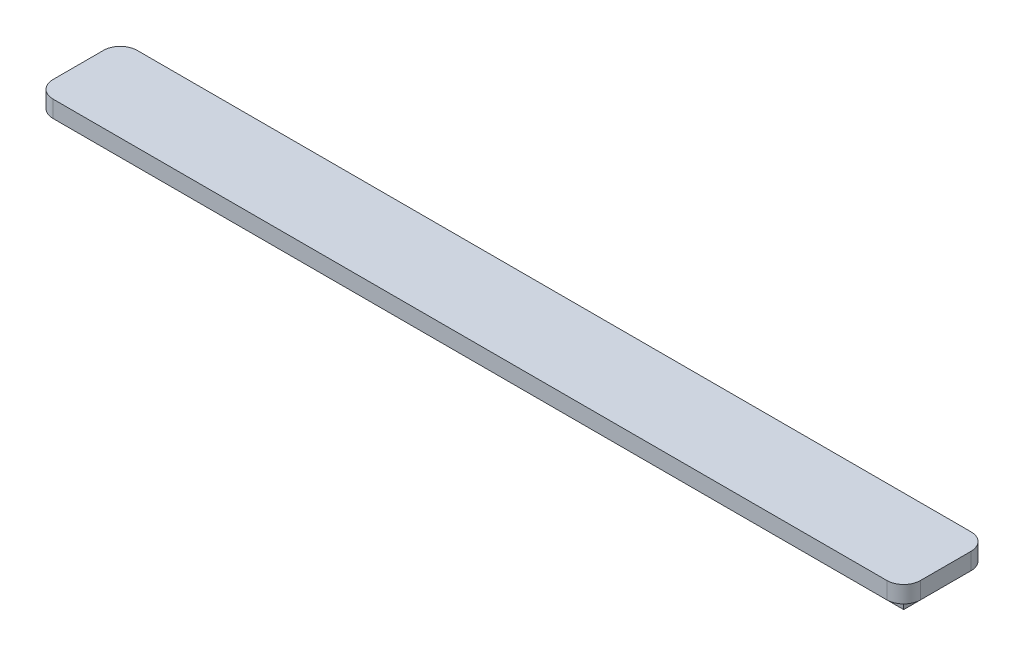
ISO-10303-21;
HEADER;
FILE_DESCRIPTION(('STEP AP214'),'2;1');
FILE_NAME('part.step','',(''),(''),'','','');
FILE_SCHEMA(('AUTOMOTIVE_DESIGN { 1 0 10303 214 1 1 1 1 }'));
ENDSEC;
DATA;
#1=APPLICATION_CONTEXT('core data for automotive mechanical design processes');
#2=APPLICATION_PROTOCOL_DEFINITION('international standard','automotive_design',2000,#1);
#3=PRODUCT_CONTEXT('',#1,'mechanical');
#4=PRODUCT('Part','Part','',(#3));
#5=PRODUCT_RELATED_PRODUCT_CATEGORY('part','',(#4));
#6=PRODUCT_DEFINITION_FORMATION('','',#4);
#7=PRODUCT_DEFINITION_CONTEXT('part definition',#1,'design');
#8=PRODUCT_DEFINITION('design','',#6,#7);
#9=PRODUCT_DEFINITION_SHAPE('','',#8);
#10=(LENGTH_UNIT() NAMED_UNIT(*) SI_UNIT(.MILLI.,.METRE.));
#11=(NAMED_UNIT(*) PLANE_ANGLE_UNIT() SI_UNIT($,.RADIAN.));
#12=(NAMED_UNIT(*) SI_UNIT($,.STERADIAN.) SOLID_ANGLE_UNIT());
#13=UNCERTAINTY_MEASURE_WITH_UNIT(LENGTH_MEASURE(1.E-05),#10,'distance_accuracy_value','');
#14=(GEOMETRIC_REPRESENTATION_CONTEXT(3) GLOBAL_UNCERTAINTY_ASSIGNED_CONTEXT((#13)) GLOBAL_UNIT_ASSIGNED_CONTEXT((#10,
#11,#12)) REPRESENTATION_CONTEXT('',''));
#15=CARTESIAN_POINT('',(0.,0.,0.));
#16=DIRECTION('',(0.,0.,1.));
#17=DIRECTION('',(1.,0.,0.));
#18=AXIS2_PLACEMENT_3D('',#15,#16,#17);
#19=CARTESIAN_POINT('',(49.5,0.,-3.));
#20=DIRECTION('',(0.984807753012208,-0.173648177666931,0.));
#21=DIRECTION('',(0.173648177666931,0.984807753012208,0.));
#22=AXIS2_PLACEMENT_3D('',#19,#20,#21);
#23=PLANE('',#22);
#24=DIRECTION('',(0.,0.,-1.));
#25=VECTOR('',#24,1.);
#26=CARTESIAN_POINT('',(49.5,0.,-3.));
#27=LINE('',#26,#25);
#28=CARTESIAN_POINT('',(49.5,0.,3.));
#29=VERTEX_POINT('',#28);
#30=CARTESIAN_POINT('',(49.5,0.,-3.));
#31=VERTEX_POINT('',#30);
#32=EDGE_CURVE('E230',#29,#31,#27,.T.);
#33=ORIENTED_EDGE('',*,*,#32,.T.);
#34=DIRECTION('',(-0.171087869746036,-0.970287525247814,0.171087869746036));
#35=VECTOR('',#34,1.);
#36=CARTESIAN_POINT('',(46.6021651417506,-16.4344381478444,-0.102165141750576));
#37=LINE('',#36,#35);
#38=CARTESIAN_POINT('',(49.852653961417,2.,-3.35265396141693));
#39=VERTEX_POINT('',#38);
#40=EDGE_CURVE('E137',#39,#31,#37,.T.);
#41=ORIENTED_EDGE('',*,*,#40,.F.);
#42=DIRECTION('',(0.,0.,1.));
#43=VECTOR('',#42,1.);
#44=CARTESIAN_POINT('',(49.852653961417,2.,-3.));
#45=LINE('',#44,#43);
#46=CARTESIAN_POINT('',(49.852653961417,2.,3.35265396141693));
#47=VERTEX_POINT('',#46);
#48=EDGE_CURVE('E131',#47,#39,#45,.F.);
#49=ORIENTED_EDGE('',*,*,#48,.F.);
#50=DIRECTION('',(-0.171087869746036,-0.970287525247814,-0.171087869746036));
#51=VECTOR('',#50,1.);
#52=CARTESIAN_POINT('',(49.3243736449546,-0.996026554414807,2.82437364495458));
#53=LINE('',#52,#51);
#54=EDGE_CURVE('E134',#47,#29,#53,.T.);
#55=ORIENTED_EDGE('',*,*,#54,.T.);
#56=EDGE_LOOP('',(#33,#41,#49,#55));
#57=FACE_BOUND('',#56,.T.);
#58=ADVANCED_FACE('F39',(#57),#23,.T.);
#59=CARTESIAN_POINT('',(-49.5,0.,-3.));
#60=DIRECTION('',(0.,-0.173648177666931,-0.984807753012208));
#61=DIRECTION('',(0.,0.984807753012208,-0.173648177666931));
#62=AXIS2_PLACEMENT_3D('',#59,#60,#61);
#63=PLANE('',#62);
#64=DIRECTION('',(-1.,0.,0.));
#65=VECTOR('',#64,1.);
#66=CARTESIAN_POINT('',(-49.5,0.,-3.));
#67=LINE('',#66,#65);
#68=CARTESIAN_POINT('',(-49.5,0.,-3.));
#69=VERTEX_POINT('',#68);
#70=EDGE_CURVE('E219',#31,#69,#67,.T.);
#71=ORIENTED_EDGE('',*,*,#70,.T.);
#72=DIRECTION('',(0.171087869746036,-0.970287525247814,0.171087869746036));
#73=VECTOR('',#72,1.);
#74=CARTESIAN_POINT('',(-49.5,0.,-3.));
#75=LINE('',#74,#73);
#76=CARTESIAN_POINT('',(-49.8526539614169,2.,-3.35265396141693));
#77=VERTEX_POINT('',#76);
#78=EDGE_CURVE('E210',#77,#69,#75,.T.);
#79=ORIENTED_EDGE('',*,*,#78,.F.);
#80=DIRECTION('',(1.,0.,0.));
#81=VECTOR('',#80,1.);
#82=CARTESIAN_POINT('',(-49.5,2.,-3.35265396141693));
#83=LINE('',#82,#81);
#84=EDGE_CURVE('E142',#39,#77,#83,.F.);
#85=ORIENTED_EDGE('',*,*,#84,.F.);
#86=ORIENTED_EDGE('',*,*,#40,.T.);
#87=EDGE_LOOP('',(#71,#79,#85,#86));
#88=FACE_BOUND('',#87,.T.);
#89=ADVANCED_FACE('F218',(#88),#63,.T.);
#90=CARTESIAN_POINT('',(-49.5,0.,-3.));
#91=DIRECTION('',(-0.984807753012208,-0.173648177666931,0.));
#92=DIRECTION('',(0.173648177666931,-0.984807753012208,0.));
#93=AXIS2_PLACEMENT_3D('',#90,#91,#92);
#94=PLANE('',#93);
#95=DIRECTION('',(0.,0.,1.));
#96=VECTOR('',#95,1.);
#97=CARTESIAN_POINT('',(-49.5,0.,-3.));
#98=LINE('',#97,#96);
#99=CARTESIAN_POINT('',(-49.5,0.,3.));
#100=VERTEX_POINT('',#99);
#101=EDGE_CURVE('E223',#69,#100,#98,.T.);
#102=ORIENTED_EDGE('',*,*,#101,.T.);
#103=DIRECTION('',(0.171087869746036,-0.970287525247814,-0.171087869746036));
#104=VECTOR('',#103,1.);
#105=CARTESIAN_POINT('',(-49.5,0.,3.));
#106=LINE('',#105,#104);
#107=CARTESIAN_POINT('',(-49.8526539614169,2.,3.35265396141693));
#108=VERTEX_POINT('',#107);
#109=EDGE_CURVE('E153',#108,#100,#106,.T.);
#110=ORIENTED_EDGE('',*,*,#109,.F.);
#111=DIRECTION('',(0.,0.,-1.));
#112=VECTOR('',#111,1.);
#113=CARTESIAN_POINT('',(-49.8526539614169,2.,-3.));
#114=LINE('',#113,#112);
#115=EDGE_CURVE('E157',#77,#108,#114,.F.);
#116=ORIENTED_EDGE('',*,*,#115,.F.);
#117=ORIENTED_EDGE('',*,*,#78,.T.);
#118=EDGE_LOOP('',(#102,#110,#116,#117));
#119=FACE_BOUND('',#118,.T.);
#120=ADVANCED_FACE('F222',(#119),#94,.T.);
#121=CARTESIAN_POINT('',(-49.5,0.,3.));
#122=DIRECTION('',(0.,-0.173648177666931,0.984807753012208));
#123=DIRECTION('',(0.,-0.984807753012208,-0.173648177666931));
#124=AXIS2_PLACEMENT_3D('',#121,#122,#123);
#125=PLANE('',#124);
#126=DIRECTION('',(1.,0.,0.));
#127=VECTOR('',#126,1.);
#128=CARTESIAN_POINT('',(-49.5,0.,3.));
#129=LINE('',#128,#127);
#130=EDGE_CURVE('E143',#100,#29,#129,.T.);
#131=ORIENTED_EDGE('',*,*,#130,.T.);
#132=ORIENTED_EDGE('',*,*,#54,.F.);
#133=DIRECTION('',(-1.,0.,0.));
#134=VECTOR('',#133,1.);
#135=CARTESIAN_POINT('',(-49.5,2.,3.35265396141693));
#136=LINE('',#135,#134);
#137=EDGE_CURVE('E149',#108,#47,#136,.F.);
#138=ORIENTED_EDGE('',*,*,#137,.F.);
#139=ORIENTED_EDGE('',*,*,#109,.T.);
#140=EDGE_LOOP('',(#131,#132,#138,#139));
#141=FACE_BOUND('',#140,.T.);
#142=ADVANCED_FACE('F147',(#141),#125,.T.);
#143=CARTESIAN_POINT('',(0.,0.,0.));
#144=DIRECTION('',(0.,1.,0.));
#145=DIRECTION('',(0.,0.,1.));
#146=AXIS2_PLACEMENT_3D('',#143,#144,#145);
#147=PLANE('',#146);
#148=ORIENTED_EDGE('',*,*,#32,.F.);
#149=ORIENTED_EDGE('',*,*,#130,.F.);
#150=ORIENTED_EDGE('',*,*,#101,.F.);
#151=ORIENTED_EDGE('',*,*,#70,.F.);
#152=EDGE_LOOP('',(#148,#149,#150,#151));
#153=FACE_BOUND('',#152,.T.);
#154=ADVANCED_FACE('F297',(#153),#147,.F.);
#155=CARTESIAN_POINT('',(0.,2.,0.));
#156=DIRECTION('',(0.,1.,0.));
#157=DIRECTION('',(0.,0.,1.));
#158=AXIS2_PLACEMENT_3D('',#155,#156,#157);
#159=PLANE('',#158);
#160=ORIENTED_EDGE('',*,*,#137,.T.);
#161=ORIENTED_EDGE('',*,*,#48,.T.);
#162=ORIENTED_EDGE('',*,*,#84,.T.);
#163=ORIENTED_EDGE('',*,*,#115,.T.);
#164=EDGE_LOOP('',(#160,#161,#162,#163));
#165=FACE_BOUND('',#164,.T.);
#166=DIRECTION('',(0.,0.,1.));
#167=VECTOR('',#166,1.);
#168=CARTESIAN_POINT('',(-51.5,2.,-5.));
#169=LINE('',#168,#167);
#170=CARTESIAN_POINT('',(-51.5,2.,-3.));
#171=VERTEX_POINT('',#170);
#172=CARTESIAN_POINT('',(-51.5,2.,3.));
#173=VERTEX_POINT('',#172);
#174=EDGE_CURVE('E240',#171,#173,#169,.T.);
#175=ORIENTED_EDGE('',*,*,#174,.F.);
#176=CARTESIAN_POINT('',(-49.5,2.,-3.));
#177=DIRECTION('',(0.,1.,0.));
#178=DIRECTION('',(0.,0.,1.));
#179=AXIS2_PLACEMENT_3D('',#176,#177,#178);
#180=CIRCLE('',#179,2.);
#181=CARTESIAN_POINT('',(-49.5,2.,-5.));
#182=VERTEX_POINT('',#181);
#183=EDGE_CURVE('E198',#171,#182,#180,.F.);
#184=ORIENTED_EDGE('',*,*,#183,.T.);
#185=DIRECTION('',(-1.,0.,0.));
#186=VECTOR('',#185,1.);
#187=CARTESIAN_POINT('',(51.5,2.,-5.));
#188=LINE('',#187,#186);
#189=CARTESIAN_POINT('',(49.5,2.,-5.));
#190=VERTEX_POINT('',#189);
#191=EDGE_CURVE('E235',#190,#182,#188,.T.);
#192=ORIENTED_EDGE('',*,*,#191,.F.);
#193=CARTESIAN_POINT('',(49.5,2.,-3.));
#194=DIRECTION('',(0.,1.,0.));
#195=DIRECTION('',(0.,0.,1.));
#196=AXIS2_PLACEMENT_3D('',#193,#194,#195);
#197=CIRCLE('',#196,2.);
#198=CARTESIAN_POINT('',(51.5,2.,-3.));
#199=VERTEX_POINT('',#198);
#200=EDGE_CURVE('E195',#190,#199,#197,.F.);
#201=ORIENTED_EDGE('',*,*,#200,.T.);
#202=DIRECTION('',(0.,0.,-1.));
#203=VECTOR('',#202,1.);
#204=CARTESIAN_POINT('',(51.5,2.,5.));
#205=LINE('',#204,#203);
#206=CARTESIAN_POINT('',(51.5,2.,3.));
#207=VERTEX_POINT('',#206);
#208=EDGE_CURVE('E256',#207,#199,#205,.T.);
#209=ORIENTED_EDGE('',*,*,#208,.F.);
#210=CARTESIAN_POINT('',(49.5,2.,3.));
#211=DIRECTION('',(0.,1.,0.));
#212=DIRECTION('',(0.,0.,1.));
#213=AXIS2_PLACEMENT_3D('',#210,#211,#212);
#214=CIRCLE('',#213,2.);
#215=CARTESIAN_POINT('',(49.5,2.,5.));
#216=VERTEX_POINT('',#215);
#217=EDGE_CURVE('E55',#207,#216,#214,.F.);
#218=ORIENTED_EDGE('',*,*,#217,.T.);
#219=DIRECTION('',(1.,0.,0.));
#220=VECTOR('',#219,1.);
#221=CARTESIAN_POINT('',(-51.5,2.,5.));
#222=LINE('',#221,#220);
#223=CARTESIAN_POINT('',(-49.5,2.,5.));
#224=VERTEX_POINT('',#223);
#225=EDGE_CURVE('E260',#224,#216,#222,.T.);
#226=ORIENTED_EDGE('',*,*,#225,.F.);
#227=CARTESIAN_POINT('',(-49.5,2.,3.));
#228=DIRECTION('',(0.,1.,0.));
#229=DIRECTION('',(0.,0.,1.));
#230=AXIS2_PLACEMENT_3D('',#227,#228,#229);
#231=CIRCLE('',#230,2.);
#232=EDGE_CURVE('E190',#224,#173,#231,.F.);
#233=ORIENTED_EDGE('',*,*,#232,.T.);
#234=EDGE_LOOP('',(#175,#184,#192,#201,#209,#218,#226,#233));
#235=FACE_BOUND('',#234,.T.);
#236=ADVANCED_FACE('F155',(#165,#235),#159,.F.);
#237=CARTESIAN_POINT('',(-51.5,2.,-5.));
#238=DIRECTION('',(-1.,0.,0.));
#239=DIRECTION('',(0.,0.,1.));
#240=AXIS2_PLACEMENT_3D('',#237,#238,#239);
#241=PLANE('',#240);
#242=DIRECTION('',(0.,0.,1.));
#243=VECTOR('',#242,1.);
#244=CARTESIAN_POINT('',(-51.5,4.,-5.));
#245=LINE('',#244,#243);
#246=CARTESIAN_POINT('',(-51.5,4.,-3.));
#247=VERTEX_POINT('',#246);
#248=CARTESIAN_POINT('',(-51.5,4.,3.));
#249=VERTEX_POINT('',#248);
#250=EDGE_CURVE('E249',#247,#249,#245,.T.);
#251=ORIENTED_EDGE('',*,*,#250,.F.);
#252=DIRECTION('',(0.,1.,0.));
#253=VECTOR('',#252,1.);
#254=CARTESIAN_POINT('',(-51.5,2.,-3.));
#255=LINE('',#254,#253);
#256=EDGE_CURVE('E187',#247,#171,#255,.F.);
#257=ORIENTED_EDGE('',*,*,#256,.T.);
#258=ORIENTED_EDGE('',*,*,#174,.T.);
#259=DIRECTION('',(0.,1.,0.));
#260=VECTOR('',#259,1.);
#261=CARTESIAN_POINT('',(-51.5,2.,3.));
#262=LINE('',#261,#260);
#263=EDGE_CURVE('E183',#173,#249,#262,.T.);
#264=ORIENTED_EDGE('',*,*,#263,.T.);
#265=EDGE_LOOP('',(#251,#257,#258,#264));
#266=FACE_BOUND('',#265,.T.);
#267=ADVANCED_FACE('F269',(#266),#241,.T.);
#268=CARTESIAN_POINT('',(51.5,2.,-5.));
#269=DIRECTION('',(0.,0.,-1.));
#270=DIRECTION('',(-1.,0.,0.));
#271=AXIS2_PLACEMENT_3D('',#268,#269,#270);
#272=PLANE('',#271);
#273=ORIENTED_EDGE('',*,*,#191,.T.);
#274=DIRECTION('',(0.,1.,0.));
#275=VECTOR('',#274,1.);
#276=CARTESIAN_POINT('',(-49.5,2.,-5.));
#277=LINE('',#276,#275);
#278=CARTESIAN_POINT('',(-49.5,4.,-5.));
#279=VERTEX_POINT('',#278);
#280=EDGE_CURVE('E167',#182,#279,#277,.T.);
#281=ORIENTED_EDGE('',*,*,#280,.T.);
#282=DIRECTION('',(-1.,0.,0.));
#283=VECTOR('',#282,1.);
#284=CARTESIAN_POINT('',(51.5,4.,-5.));
#285=LINE('',#284,#283);
#286=CARTESIAN_POINT('',(49.5,4.,-5.));
#287=VERTEX_POINT('',#286);
#288=EDGE_CURVE('E236',#287,#279,#285,.T.);
#289=ORIENTED_EDGE('',*,*,#288,.F.);
#290=DIRECTION('',(0.,1.,0.));
#291=VECTOR('',#290,1.);
#292=CARTESIAN_POINT('',(49.5,2.,-5.));
#293=LINE('',#292,#291);
#294=EDGE_CURVE('E164',#287,#190,#293,.F.);
#295=ORIENTED_EDGE('',*,*,#294,.T.);
#296=EDGE_LOOP('',(#273,#281,#289,#295));
#297=FACE_BOUND('',#296,.T.);
#298=ADVANCED_FACE('F291',(#297),#272,.T.);
#299=CARTESIAN_POINT('',(51.5,2.,5.));
#300=DIRECTION('',(1.,0.,0.));
#301=DIRECTION('',(0.,0.,-1.));
#302=AXIS2_PLACEMENT_3D('',#299,#300,#301);
#303=PLANE('',#302);
#304=ORIENTED_EDGE('',*,*,#208,.T.);
#305=DIRECTION('',(0.,1.,0.));
#306=VECTOR('',#305,1.);
#307=CARTESIAN_POINT('',(51.5,2.,-3.));
#308=LINE('',#307,#306);
#309=CARTESIAN_POINT('',(51.5,4.,-3.));
#310=VERTEX_POINT('',#309);
#311=EDGE_CURVE('E204',#199,#310,#308,.T.);
#312=ORIENTED_EDGE('',*,*,#311,.T.);
#313=DIRECTION('',(0.,0.,-1.));
#314=VECTOR('',#313,1.);
#315=CARTESIAN_POINT('',(51.5,4.,5.));
#316=LINE('',#315,#314);
#317=CARTESIAN_POINT('',(51.5,4.,3.));
#318=VERTEX_POINT('',#317);
#319=EDGE_CURVE('E241',#318,#310,#316,.T.);
#320=ORIENTED_EDGE('',*,*,#319,.F.);
#321=DIRECTION('',(0.,1.,0.));
#322=VECTOR('',#321,1.);
#323=CARTESIAN_POINT('',(51.5,2.,3.));
#324=LINE('',#323,#322);
#325=EDGE_CURVE('E201',#318,#207,#324,.F.);
#326=ORIENTED_EDGE('',*,*,#325,.T.);
#327=EDGE_LOOP('',(#304,#312,#320,#326));
#328=FACE_BOUND('',#327,.T.);
#329=ADVANCED_FACE('F283',(#328),#303,.T.);
#330=CARTESIAN_POINT('',(-51.5,2.,5.));
#331=DIRECTION('',(0.,0.,1.));
#332=DIRECTION('',(1.,0.,0.));
#333=AXIS2_PLACEMENT_3D('',#330,#331,#332);
#334=PLANE('',#333);
#335=ORIENTED_EDGE('',*,*,#225,.T.);
#336=DIRECTION('',(0.,1.,0.));
#337=VECTOR('',#336,1.);
#338=CARTESIAN_POINT('',(49.5,2.,5.));
#339=LINE('',#338,#337);
#340=CARTESIAN_POINT('',(49.5,4.,5.));
#341=VERTEX_POINT('',#340);
#342=EDGE_CURVE('E11',#216,#341,#339,.T.);
#343=ORIENTED_EDGE('',*,*,#342,.T.);
#344=DIRECTION('',(1.,0.,0.));
#345=VECTOR('',#344,1.);
#346=CARTESIAN_POINT('',(-51.5,4.,5.));
#347=LINE('',#346,#345);
#348=CARTESIAN_POINT('',(-49.5,4.,5.));
#349=VERTEX_POINT('',#348);
#350=EDGE_CURVE('E245',#349,#341,#347,.T.);
#351=ORIENTED_EDGE('',*,*,#350,.F.);
#352=DIRECTION('',(0.,1.,0.));
#353=VECTOR('',#352,1.);
#354=CARTESIAN_POINT('',(-49.5,2.,5.));
#355=LINE('',#354,#353);
#356=EDGE_CURVE('E48',#349,#224,#355,.F.);
#357=ORIENTED_EDGE('',*,*,#356,.T.);
#358=EDGE_LOOP('',(#335,#343,#351,#357));
#359=FACE_BOUND('',#358,.T.);
#360=ADVANCED_FACE('F276',(#359),#334,.T.);
#361=CARTESIAN_POINT('',(0.,4.,0.));
#362=DIRECTION('',(0.,1.,0.));
#363=DIRECTION('',(0.,0.,1.));
#364=AXIS2_PLACEMENT_3D('',#361,#362,#363);
#365=PLANE('',#364);
#366=ORIENTED_EDGE('',*,*,#288,.T.);
#367=CARTESIAN_POINT('',(-49.5,4.,-3.));
#368=DIRECTION('',(0.,1.,0.));
#369=DIRECTION('',(0.,0.,1.));
#370=AXIS2_PLACEMENT_3D('',#367,#368,#369);
#371=CIRCLE('',#370,2.);
#372=EDGE_CURVE('E180',#279,#247,#371,.T.);
#373=ORIENTED_EDGE('',*,*,#372,.T.);
#374=ORIENTED_EDGE('',*,*,#250,.T.);
#375=CARTESIAN_POINT('',(-49.5,4.,3.));
#376=DIRECTION('',(0.,1.,0.));
#377=DIRECTION('',(0.,0.,1.));
#378=AXIS2_PLACEMENT_3D('',#375,#376,#377);
#379=CIRCLE('',#378,2.);
#380=EDGE_CURVE('E171',#249,#349,#379,.T.);
#381=ORIENTED_EDGE('',*,*,#380,.T.);
#382=ORIENTED_EDGE('',*,*,#350,.T.);
#383=CARTESIAN_POINT('',(49.5,4.,3.));
#384=DIRECTION('',(0.,1.,0.));
#385=DIRECTION('',(0.,0.,1.));
#386=AXIS2_PLACEMENT_3D('',#383,#384,#385);
#387=CIRCLE('',#386,2.);
#388=EDGE_CURVE('E174',#341,#318,#387,.T.);
#389=ORIENTED_EDGE('',*,*,#388,.T.);
#390=ORIENTED_EDGE('',*,*,#319,.T.);
#391=CARTESIAN_POINT('',(49.5,4.,-3.));
#392=DIRECTION('',(0.,1.,0.));
#393=DIRECTION('',(0.,0.,1.));
#394=AXIS2_PLACEMENT_3D('',#391,#392,#393);
#395=CIRCLE('',#394,2.);
#396=EDGE_CURVE('E177',#310,#287,#395,.T.);
#397=ORIENTED_EDGE('',*,*,#396,.T.);
#398=EDGE_LOOP('',(#366,#373,#374,#381,#382,#389,#390,#397));
#399=FACE_BOUND('',#398,.T.);
#400=ADVANCED_FACE('F275',(#399),#365,.T.);
#401=CARTESIAN_POINT('',(-49.5,2.,-3.));
#402=DIRECTION('',(0.,1.,0.));
#403=DIRECTION('',(0.,0.,1.));
#404=AXIS2_PLACEMENT_3D('',#401,#402,#403);
#405=CYLINDRICAL_SURFACE('',#404,2.);
#406=ORIENTED_EDGE('',*,*,#183,.F.);
#407=ORIENTED_EDGE('',*,*,#256,.F.);
#408=ORIENTED_EDGE('',*,*,#372,.F.);
#409=ORIENTED_EDGE('',*,*,#280,.F.);
#410=EDGE_LOOP('',(#406,#407,#408,#409));
#411=FACE_BOUND('',#410,.T.);
#412=ADVANCED_FACE('F295',(#411),#405,.T.);
#413=CARTESIAN_POINT('',(49.5,2.,-3.));
#414=DIRECTION('',(0.,1.,0.));
#415=DIRECTION('',(0.,0.,1.));
#416=AXIS2_PLACEMENT_3D('',#413,#414,#415);
#417=CYLINDRICAL_SURFACE('',#416,2.);
#418=ORIENTED_EDGE('',*,*,#200,.F.);
#419=ORIENTED_EDGE('',*,*,#294,.F.);
#420=ORIENTED_EDGE('',*,*,#396,.F.);
#421=ORIENTED_EDGE('',*,*,#311,.F.);
#422=EDGE_LOOP('',(#418,#419,#420,#421));
#423=FACE_BOUND('',#422,.T.);
#424=ADVANCED_FACE('F287',(#423),#417,.T.);
#425=CARTESIAN_POINT('',(49.5,2.,3.));
#426=DIRECTION('',(0.,1.,0.));
#427=DIRECTION('',(0.,0.,1.));
#428=AXIS2_PLACEMENT_3D('',#425,#426,#427);
#429=CYLINDRICAL_SURFACE('',#428,2.);
#430=ORIENTED_EDGE('',*,*,#217,.F.);
#431=ORIENTED_EDGE('',*,*,#325,.F.);
#432=ORIENTED_EDGE('',*,*,#388,.F.);
#433=ORIENTED_EDGE('',*,*,#342,.F.);
#434=EDGE_LOOP('',(#430,#431,#432,#433));
#435=FACE_BOUND('',#434,.T.);
#436=ADVANCED_FACE('F279',(#435),#429,.T.);
#437=CARTESIAN_POINT('',(-49.5,2.,3.));
#438=DIRECTION('',(0.,1.,0.));
#439=DIRECTION('',(0.,0.,1.));
#440=AXIS2_PLACEMENT_3D('',#437,#438,#439);
#441=CYLINDRICAL_SURFACE('',#440,2.);
#442=ORIENTED_EDGE('',*,*,#232,.F.);
#443=ORIENTED_EDGE('',*,*,#356,.F.);
#444=ORIENTED_EDGE('',*,*,#380,.F.);
#445=ORIENTED_EDGE('',*,*,#263,.F.);
#446=EDGE_LOOP('',(#442,#443,#444,#445));
#447=FACE_BOUND('',#446,.T.);
#448=ADVANCED_FACE('F41',(#447),#441,.T.);
#449=CLOSED_SHELL('',(#58,#89,#120,#142,#154,#236,#267,#298,#329,#360,#400,#412,#424,#436,#448));
#450=MANIFOLD_SOLID_BREP('B2',#449);
#451=ADVANCED_BREP_SHAPE_REPRESENTATION('',(#18,#450),#14);
#452=SHAPE_DEFINITION_REPRESENTATION(#9,#451);
ENDSEC;
END-ISO-10303-21;
